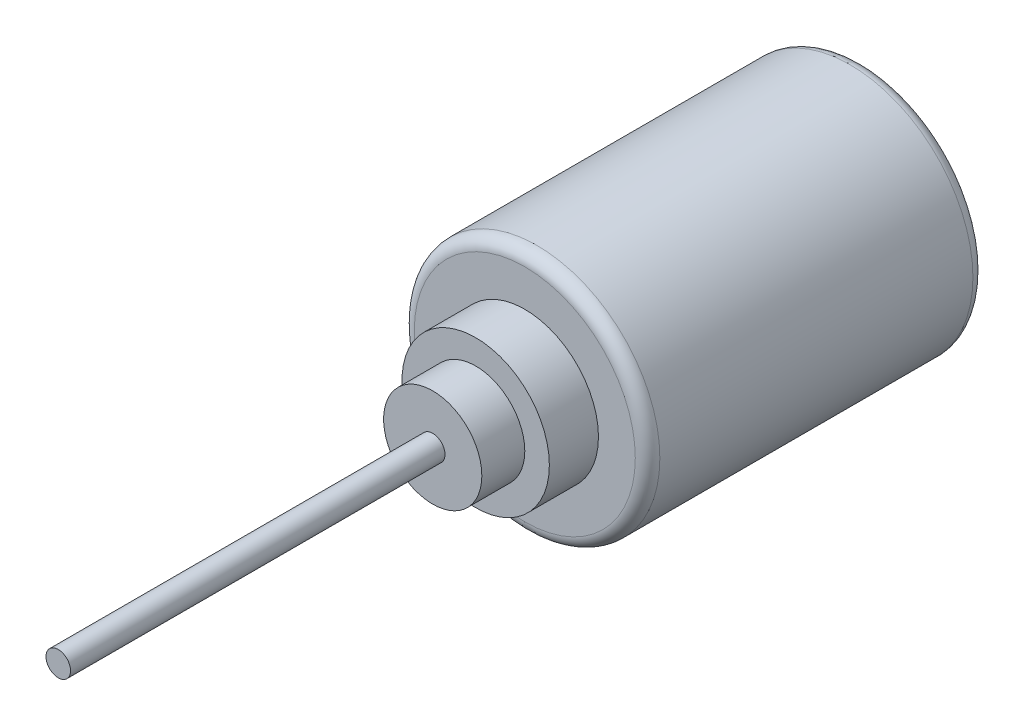
ISO-10303-21;
HEADER;
FILE_DESCRIPTION(('STEP AP214'),'2;1');
FILE_NAME('part.step','',(''),(''),'','','');
FILE_SCHEMA(('AUTOMOTIVE_DESIGN { 1 0 10303 214 1 1 1 1 }'));
ENDSEC;
DATA;
#1=APPLICATION_CONTEXT('core data for automotive mechanical design processes');
#2=APPLICATION_PROTOCOL_DEFINITION('international standard','automotive_design',2000,#1);
#3=PRODUCT_CONTEXT('',#1,'mechanical');
#4=PRODUCT('Part','Part','',(#3));
#5=PRODUCT_RELATED_PRODUCT_CATEGORY('part','',(#4));
#6=PRODUCT_DEFINITION_FORMATION('','',#4);
#7=PRODUCT_DEFINITION_CONTEXT('part definition',#1,'design');
#8=PRODUCT_DEFINITION('design','',#6,#7);
#9=PRODUCT_DEFINITION_SHAPE('','',#8);
#10=(LENGTH_UNIT() NAMED_UNIT(*) SI_UNIT(.MILLI.,.METRE.));
#11=(NAMED_UNIT(*) PLANE_ANGLE_UNIT() SI_UNIT($,.RADIAN.));
#12=(NAMED_UNIT(*) SI_UNIT($,.STERADIAN.) SOLID_ANGLE_UNIT());
#13=UNCERTAINTY_MEASURE_WITH_UNIT(LENGTH_MEASURE(1.E-05),#10,'distance_accuracy_value','');
#14=(GEOMETRIC_REPRESENTATION_CONTEXT(3) GLOBAL_UNCERTAINTY_ASSIGNED_CONTEXT((#13)) GLOBAL_UNIT_ASSIGNED_CONTEXT((#10,
#11,#12)) REPRESENTATION_CONTEXT('',''));
#15=CARTESIAN_POINT('',(0.,0.,0.));
#16=DIRECTION('',(0.,0.,1.));
#17=DIRECTION('',(1.,0.,0.));
#18=AXIS2_PLACEMENT_3D('',#15,#16,#17);
#19=CARTESIAN_POINT('',(0.,0.,42.8507304625844));
#20=DIRECTION('',(0.,0.,-1.));
#21=DIRECTION('',(-1.,0.,0.));
#22=AXIS2_PLACEMENT_3D('',#19,#20,#21);
#23=CYLINDRICAL_SURFACE('',#22,2.5);
#24=CARTESIAN_POINT('',(0.,0.,40.6632304625844));
#25=DIRECTION('',(0.,0.,1.));
#26=DIRECTION('',(1.,0.,0.));
#27=AXIS2_PLACEMENT_3D('',#24,#25,#26);
#28=CIRCLE('',#27,2.5);
#29=CARTESIAN_POINT('',(2.5,0.,40.6632304625844));
#30=VERTEX_POINT('',#29);
#31=EDGE_CURVE('E57',#30,#30,#28,.T.);
#32=ORIENTED_EDGE('',*,*,#31,.T.);
#33=EDGE_LOOP('',(#32));
#34=FACE_BOUND('',#33,.T.);
#35=CARTESIAN_POINT('',(0.,0.,42.8507304625844));
#36=DIRECTION('',(0.,0.,1.));
#37=DIRECTION('',(1.,0.,0.));
#38=AXIS2_PLACEMENT_3D('',#35,#36,#37);
#39=CIRCLE('',#38,2.5);
#40=CARTESIAN_POINT('',(2.5,0.,42.8507304625844));
#41=VERTEX_POINT('',#40);
#42=EDGE_CURVE('E60',#41,#41,#39,.T.);
#43=ORIENTED_EDGE('',*,*,#42,.F.);
#44=EDGE_LOOP('',(#43));
#45=FACE_BOUND('',#44,.T.);
#46=ADVANCED_FACE('F36',(#34,#45),#23,.T.);
#47=CARTESIAN_POINT('',(0.,0.,42.8507304625844));
#48=DIRECTION('',(0.,0.,1.));
#49=DIRECTION('',(1.,0.,0.));
#50=AXIS2_PLACEMENT_3D('',#47,#48,#49);
#51=PLANE('',#50);
#52=CARTESIAN_POINT('',(0.,0.,42.8507304625844));
#53=DIRECTION('',(0.,0.,1.));
#54=DIRECTION('',(1.,0.,0.));
#55=AXIS2_PLACEMENT_3D('',#52,#53,#54);
#56=CIRCLE('',#55,0.625);
#57=CARTESIAN_POINT('',(0.625,0.,42.8507304625844));
#58=VERTEX_POINT('',#57);
#59=EDGE_CURVE('E62',#58,#58,#56,.T.);
#60=ORIENTED_EDGE('',*,*,#59,.F.);
#61=EDGE_LOOP('',(#60));
#62=FACE_BOUND('',#61,.T.);
#63=ORIENTED_EDGE('',*,*,#42,.T.);
#64=EDGE_LOOP('',(#63));
#65=FACE_BOUND('',#64,.T.);
#66=ADVANCED_FACE('F100',(#62,#65),#51,.T.);
#67=CARTESIAN_POINT('',(0.,0.,61.9132304625844));
#68=DIRECTION('',(0.,0.,1.));
#69=DIRECTION('',(1.,0.,0.));
#70=AXIS2_PLACEMENT_3D('',#67,#68,#69);
#71=PLANE('',#70);
#72=CARTESIAN_POINT('',(0.,0.,61.9132304625844));
#73=DIRECTION('',(0.,0.,1.));
#74=DIRECTION('',(1.,0.,0.));
#75=AXIS2_PLACEMENT_3D('',#72,#73,#74);
#76=CIRCLE('',#75,0.625);
#77=CARTESIAN_POINT('',(0.625,0.,61.9132304625844));
#78=VERTEX_POINT('',#77);
#79=EDGE_CURVE('E56',#78,#78,#76,.T.);
#80=ORIENTED_EDGE('',*,*,#79,.T.);
#81=EDGE_LOOP('',(#80));
#82=FACE_BOUND('',#81,.T.);
#83=ADVANCED_FACE('F106',(#82),#71,.T.);
#84=CARTESIAN_POINT('',(0.,0.,61.9132304625844));
#85=DIRECTION('',(0.,0.,-1.));
#86=DIRECTION('',(-1.,0.,0.));
#87=AXIS2_PLACEMENT_3D('',#84,#85,#86);
#88=CYLINDRICAL_SURFACE('',#87,0.625);
#89=ORIENTED_EDGE('',*,*,#59,.T.);
#90=EDGE_LOOP('',(#89));
#91=FACE_BOUND('',#90,.T.);
#92=ORIENTED_EDGE('',*,*,#79,.F.);
#93=EDGE_LOOP('',(#92));
#94=FACE_BOUND('',#93,.T.);
#95=ADVANCED_FACE('F80',(#91,#94),#88,.T.);
#96=CARTESIAN_POINT('',(0.,0.,40.6632304625844));
#97=DIRECTION('',(0.,0.,-1.));
#98=DIRECTION('',(-1.,0.,0.));
#99=AXIS2_PLACEMENT_3D('',#96,#97,#98);
#100=CYLINDRICAL_SURFACE('',#99,3.75);
#101=CARTESIAN_POINT('',(0.,0.,40.6632304625844));
#102=DIRECTION('',(0.,0.,1.));
#103=DIRECTION('',(1.,0.,0.));
#104=AXIS2_PLACEMENT_3D('',#101,#102,#103);
#105=CIRCLE('',#104,3.75);
#106=CARTESIAN_POINT('',(3.75,0.,40.6632304625844));
#107=VERTEX_POINT('',#106);
#108=EDGE_CURVE('E61',#107,#107,#105,.T.);
#109=ORIENTED_EDGE('',*,*,#108,.F.);
#110=EDGE_LOOP('',(#109));
#111=FACE_BOUND('',#110,.T.);
#112=CARTESIAN_POINT('',(0.,0.,38.1632304625844));
#113=DIRECTION('',(0.,0.,1.));
#114=DIRECTION('',(1.,0.,0.));
#115=AXIS2_PLACEMENT_3D('',#112,#113,#114);
#116=CIRCLE('',#115,3.75);
#117=CARTESIAN_POINT('',(3.75,0.,38.1632304625844));
#118=VERTEX_POINT('',#117);
#119=EDGE_CURVE('E69',#118,#118,#116,.T.);
#120=ORIENTED_EDGE('',*,*,#119,.T.);
#121=EDGE_LOOP('',(#120));
#122=FACE_BOUND('',#121,.T.);
#123=ADVANCED_FACE('F77',(#111,#122),#100,.T.);
#124=CARTESIAN_POINT('',(0.,0.,40.6632304625844));
#125=DIRECTION('',(0.,0.,1.));
#126=DIRECTION('',(1.,0.,0.));
#127=AXIS2_PLACEMENT_3D('',#124,#125,#126);
#128=PLANE('',#127);
#129=ORIENTED_EDGE('',*,*,#31,.F.);
#130=EDGE_LOOP('',(#129));
#131=FACE_BOUND('',#130,.T.);
#132=ORIENTED_EDGE('',*,*,#108,.T.);
#133=EDGE_LOOP('',(#132));
#134=FACE_BOUND('',#133,.T.);
#135=ADVANCED_FACE('F75',(#131,#134),#128,.T.);
#136=CARTESIAN_POINT('',(0.,0.,20.9757304625844));
#137=DIRECTION('',(0.,0.,1.));
#138=DIRECTION('',(1.,0.,0.));
#139=AXIS2_PLACEMENT_3D('',#136,#137,#138);
#140=PLANE('',#139);
#141=CARTESIAN_POINT('',(0.,0.,20.9757304625844));
#142=DIRECTION('',(0.,0.,1.));
#143=DIRECTION('',(1.,0.,0.));
#144=AXIS2_PLACEMENT_3D('',#141,#142,#143);
#145=CIRCLE('',#144,5.625);
#146=CARTESIAN_POINT('',(5.625,0.,20.9757304625844));
#147=VERTEX_POINT('',#146);
#148=EDGE_CURVE('E43',#147,#147,#145,.F.);
#149=ORIENTED_EDGE('',*,*,#148,.T.);
#150=EDGE_LOOP('',(#149));
#151=FACE_BOUND('',#150,.T.);
#152=ADVANCED_FACE('F94',(#151),#140,.F.);
#153=CARTESIAN_POINT('',(0.,0.,38.1632304625844));
#154=DIRECTION('',(0.,0.,-1.));
#155=DIRECTION('',(-1.,0.,0.));
#156=AXIS2_PLACEMENT_3D('',#153,#154,#155);
#157=CYLINDRICAL_SURFACE('',#156,6.25);
#158=CARTESIAN_POINT('',(0.,0.,21.6007304625844));
#159=DIRECTION('',(0.,0.,1.));
#160=DIRECTION('',(1.,0.,0.));
#161=AXIS2_PLACEMENT_3D('',#158,#159,#160);
#162=CIRCLE('',#161,6.25);
#163=CARTESIAN_POINT('',(6.25,0.,21.6007304625844));
#164=VERTEX_POINT('',#163);
#165=EDGE_CURVE('E47',#164,#164,#162,.T.);
#166=ORIENTED_EDGE('',*,*,#165,.T.);
#167=EDGE_LOOP('',(#166));
#168=FACE_BOUND('',#167,.T.);
#169=CARTESIAN_POINT('',(0.,0.,37.5382304625844));
#170=DIRECTION('',(0.,0.,1.));
#171=DIRECTION('',(1.,0.,0.));
#172=AXIS2_PLACEMENT_3D('',#169,#170,#171);
#173=CIRCLE('',#172,6.25);
#174=CARTESIAN_POINT('',(6.25,0.,37.5382304625844));
#175=VERTEX_POINT('',#174);
#176=EDGE_CURVE('E51',#175,#175,#173,.F.);
#177=ORIENTED_EDGE('',*,*,#176,.T.);
#178=EDGE_LOOP('',(#177));
#179=FACE_BOUND('',#178,.T.);
#180=ADVANCED_FACE('F87',(#168,#179),#157,.T.);
#181=CARTESIAN_POINT('',(0.,0.,38.1632304625844));
#182=DIRECTION('',(0.,0.,1.));
#183=DIRECTION('',(1.,0.,0.));
#184=AXIS2_PLACEMENT_3D('',#181,#182,#183);
#185=PLANE('',#184);
#186=CARTESIAN_POINT('',(0.,0.,38.1632304625844));
#187=DIRECTION('',(0.,0.,1.));
#188=DIRECTION('',(1.,0.,0.));
#189=AXIS2_PLACEMENT_3D('',#186,#187,#188);
#190=CIRCLE('',#189,5.625);
#191=CARTESIAN_POINT('',(5.625,0.,38.1632304625844));
#192=VERTEX_POINT('',#191);
#193=EDGE_CURVE('E10',#192,#192,#190,.T.);
#194=ORIENTED_EDGE('',*,*,#193,.T.);
#195=EDGE_LOOP('',(#194));
#196=FACE_BOUND('',#195,.T.);
#197=ORIENTED_EDGE('',*,*,#119,.F.);
#198=EDGE_LOOP('',(#197));
#199=FACE_BOUND('',#198,.T.);
#200=ADVANCED_FACE('F84',(#196,#199),#185,.T.);
#201=CARTESIAN_POINT('',(0.,0.,21.6007304625844));
#202=DIRECTION('',(0.,0.,1.));
#203=DIRECTION('',(1.,0.,0.));
#204=AXIS2_PLACEMENT_3D('',#201,#202,#203);
#205=TOROIDAL_SURFACE('',#204,5.625,0.625);
#206=ORIENTED_EDGE('',*,*,#148,.F.);
#207=EDGE_LOOP('',(#206));
#208=FACE_BOUND('',#207,.T.);
#209=ORIENTED_EDGE('',*,*,#165,.F.);
#210=EDGE_LOOP('',(#209));
#211=FACE_BOUND('',#210,.T.);
#212=ADVANCED_FACE('F86',(#208,#211),#205,.T.);
#213=CARTESIAN_POINT('',(0.,0.,37.5382304625844));
#214=DIRECTION('',(0.,0.,1.));
#215=DIRECTION('',(1.,0.,0.));
#216=AXIS2_PLACEMENT_3D('',#213,#214,#215);
#217=TOROIDAL_SURFACE('',#216,5.625,0.625);
#218=ORIENTED_EDGE('',*,*,#176,.F.);
#219=EDGE_LOOP('',(#218));
#220=FACE_BOUND('',#219,.T.);
#221=ORIENTED_EDGE('',*,*,#193,.F.);
#222=EDGE_LOOP('',(#221));
#223=FACE_BOUND('',#222,.T.);
#224=ADVANCED_FACE('F38',(#220,#223),#217,.T.);
#225=CLOSED_SHELL('',(#46,#66,#83,#95,#123,#135,#152,#180,#200,#212,#224));
#226=MANIFOLD_SOLID_BREP('B2',#225);
#227=ADVANCED_BREP_SHAPE_REPRESENTATION('',(#18,#226),#14);
#228=SHAPE_DEFINITION_REPRESENTATION(#9,#227);
ENDSEC;
END-ISO-10303-21;
